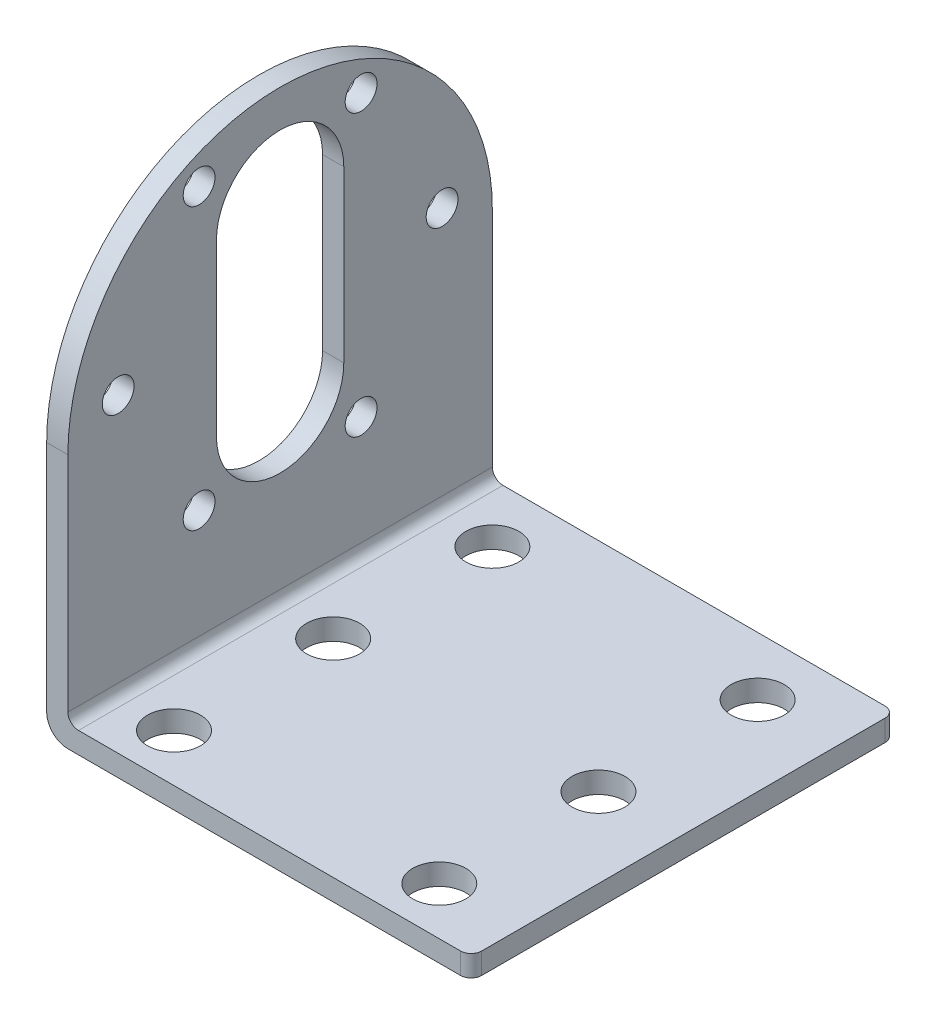
ISO-10303-21;
HEADER;
FILE_DESCRIPTION(('STEP AP214'),'2;1');
FILE_NAME('part.step','',(''),(''),'','','');
FILE_SCHEMA(('AUTOMOTIVE_DESIGN { 1 0 10303 214 1 1 1 1 }'));
ENDSEC;
DATA;
#1=APPLICATION_CONTEXT('core data for automotive mechanical design processes');
#2=APPLICATION_PROTOCOL_DEFINITION('international standard','automotive_design',2000,#1);
#3=PRODUCT_CONTEXT('',#1,'mechanical');
#4=PRODUCT('Part','Part','',(#3));
#5=PRODUCT_RELATED_PRODUCT_CATEGORY('part','',(#4));
#6=PRODUCT_DEFINITION_FORMATION('','',#4);
#7=PRODUCT_DEFINITION_CONTEXT('part definition',#1,'design');
#8=PRODUCT_DEFINITION('design','',#6,#7);
#9=PRODUCT_DEFINITION_SHAPE('','',#8);
#10=(LENGTH_UNIT() NAMED_UNIT(*) SI_UNIT(.MILLI.,.METRE.));
#11=(NAMED_UNIT(*) PLANE_ANGLE_UNIT() SI_UNIT($,.RADIAN.));
#12=(NAMED_UNIT(*) SI_UNIT($,.STERADIAN.) SOLID_ANGLE_UNIT());
#13=UNCERTAINTY_MEASURE_WITH_UNIT(LENGTH_MEASURE(1.E-05),#10,'distance_accuracy_value','');
#14=(GEOMETRIC_REPRESENTATION_CONTEXT(3) GLOBAL_UNCERTAINTY_ASSIGNED_CONTEXT((#13)) GLOBAL_UNIT_ASSIGNED_CONTEXT((#10,
#11,#12)) REPRESENTATION_CONTEXT('',''));
#15=CARTESIAN_POINT('',(0.,0.,0.));
#16=DIRECTION('',(0.,0.,1.));
#17=DIRECTION('',(1.,0.,0.));
#18=AXIS2_PLACEMENT_3D('',#15,#16,#17);
#19=CARTESIAN_POINT('',(2.,3.,40.));
#20=DIRECTION('',(-1.,0.,0.));
#21=DIRECTION('',(0.,0.,1.));
#22=AXIS2_PLACEMENT_3D('',#19,#20,#21);
#23=PLANE('',#22);
#24=CARTESIAN_POINT('',(2.,26.5,4.735));
#25=DIRECTION('',(1.,0.,0.));
#26=DIRECTION('',(0.,0.,-1.));
#27=AXIS2_PLACEMENT_3D('',#24,#25,#26);
#28=CIRCLE('',#27,1.5);
#29=CARTESIAN_POINT('',(2.,26.5,3.235));
#30=VERTEX_POINT('',#29);
#31=EDGE_CURVE('E274',#30,#30,#28,.T.);
#32=ORIENTED_EDGE('',*,*,#31,.F.);
#33=EDGE_LOOP('',(#32));
#34=FACE_BOUND('',#33,.T.);
#35=CARTESIAN_POINT('',(2.,39.7198777887694,12.3674999999999));
#36=DIRECTION('',(1.,0.,0.));
#37=DIRECTION('',(0.,0.,-1.));
#38=AXIS2_PLACEMENT_3D('',#35,#36,#37);
#39=CIRCLE('',#38,1.5);
#40=CARTESIAN_POINT('',(2.,39.7198777887694,10.8674999999999));
#41=VERTEX_POINT('',#40);
#42=EDGE_CURVE('E304',#41,#41,#39,.T.);
#43=ORIENTED_EDGE('',*,*,#42,.F.);
#44=EDGE_LOOP('',(#43));
#45=FACE_BOUND('',#44,.T.);
#46=CARTESIAN_POINT('',(2.,26.5,35.265));
#47=DIRECTION('',(1.,0.,0.));
#48=DIRECTION('',(0.,0.,-1.));
#49=AXIS2_PLACEMENT_3D('',#46,#47,#48);
#50=CIRCLE('',#49,1.5);
#51=CARTESIAN_POINT('',(2.,26.5,33.765));
#52=VERTEX_POINT('',#51);
#53=EDGE_CURVE('E317',#52,#52,#50,.T.);
#54=ORIENTED_EDGE('',*,*,#53,.F.);
#55=EDGE_LOOP('',(#54));
#56=FACE_BOUND('',#55,.T.);
#57=CARTESIAN_POINT('',(2.,13.2801222112306,27.6325000000001));
#58=DIRECTION('',(1.,0.,0.));
#59=DIRECTION('',(0.,0.,-1.));
#60=AXIS2_PLACEMENT_3D('',#57,#58,#59);
#61=CIRCLE('',#60,1.5);
#62=CARTESIAN_POINT('',(2.,13.2801222112306,26.1325000000001));
#63=VERTEX_POINT('',#62);
#64=EDGE_CURVE('E324',#63,#63,#61,.T.);
#65=ORIENTED_EDGE('',*,*,#64,.F.);
#66=EDGE_LOOP('',(#65));
#67=FACE_BOUND('',#66,.T.);
#68=CARTESIAN_POINT('',(2.,13.2801222112306,12.3674999999999));
#69=DIRECTION('',(1.,0.,0.));
#70=DIRECTION('',(0.,0.,-1.));
#71=AXIS2_PLACEMENT_3D('',#68,#69,#70);
#72=CIRCLE('',#71,1.5);
#73=CARTESIAN_POINT('',(2.,13.2801222112306,10.8674999999999));
#74=VERTEX_POINT('',#73);
#75=EDGE_CURVE('E318',#74,#74,#72,.T.);
#76=ORIENTED_EDGE('',*,*,#75,.F.);
#77=EDGE_LOOP('',(#76));
#78=FACE_BOUND('',#77,.T.);
#79=CARTESIAN_POINT('',(2.,39.7198777887694,27.6325000000001));
#80=DIRECTION('',(1.,0.,0.));
#81=DIRECTION('',(0.,0.,-1.));
#82=AXIS2_PLACEMENT_3D('',#79,#80,#81);
#83=CIRCLE('',#82,1.5);
#84=CARTESIAN_POINT('',(2.,39.7198777887694,26.1325000000001));
#85=VERTEX_POINT('',#84);
#86=EDGE_CURVE('E316',#85,#85,#83,.T.);
#87=ORIENTED_EDGE('',*,*,#86,.F.);
#88=EDGE_LOOP('',(#87));
#89=FACE_BOUND('',#88,.T.);
#90=DIRECTION('',(0.,-1.,0.));
#91=VECTOR('',#90,1.);
#92=CARTESIAN_POINT('',(2.,34.5,26.));
#93=LINE('',#92,#91);
#94=CARTESIAN_POINT('',(2.,34.5,26.));
#95=VERTEX_POINT('',#94);
#96=CARTESIAN_POINT('',(2.,18.5,26.));
#97=VERTEX_POINT('',#96);
#98=EDGE_CURVE('E164',#95,#97,#93,.T.);
#99=ORIENTED_EDGE('',*,*,#98,.F.);
#100=CARTESIAN_POINT('',(2.,34.5,20.));
#101=DIRECTION('',(1.,0.,0.));
#102=DIRECTION('',(0.,0.,-1.));
#103=AXIS2_PLACEMENT_3D('',#100,#101,#102);
#104=CIRCLE('',#103,5.99999999999999);
#105=CARTESIAN_POINT('',(2.,34.5,14.));
#106=VERTEX_POINT('',#105);
#107=EDGE_CURVE('E167',#106,#95,#104,.T.);
#108=ORIENTED_EDGE('',*,*,#107,.F.);
#109=DIRECTION('',(0.,1.,0.));
#110=VECTOR('',#109,1.);
#111=CARTESIAN_POINT('',(2.,34.5,14.));
#112=LINE('',#111,#110);
#113=CARTESIAN_POINT('',(2.,18.5,14.));
#114=VERTEX_POINT('',#113);
#115=EDGE_CURVE('E172',#114,#106,#112,.T.);
#116=ORIENTED_EDGE('',*,*,#115,.F.);
#117=CARTESIAN_POINT('',(2.,18.5,20.));
#118=DIRECTION('',(1.,0.,0.));
#119=DIRECTION('',(0.,0.,-1.));
#120=AXIS2_PLACEMENT_3D('',#117,#118,#119);
#121=CIRCLE('',#120,5.99999999999999);
#122=EDGE_CURVE('E153',#97,#114,#121,.T.);
#123=ORIENTED_EDGE('',*,*,#122,.F.);
#124=EDGE_LOOP('',(#99,#108,#116,#123));
#125=FACE_BOUND('',#124,.T.);
#126=DIRECTION('',(0.,1.,0.));
#127=VECTOR('',#126,1.);
#128=CARTESIAN_POINT('',(2.,3.,0.));
#129=LINE('',#128,#127);
#130=CARTESIAN_POINT('',(2.,3.,0.));
#131=VERTEX_POINT('',#130);
#132=CARTESIAN_POINT('',(2.,24.,0.));
#133=VERTEX_POINT('',#132);
#134=EDGE_CURVE('E231',#131,#133,#129,.T.);
#135=ORIENTED_EDGE('',*,*,#134,.T.);
#136=CARTESIAN_POINT('',(2.,24.,20.));
#137=DIRECTION('',(1.,0.,0.));
#138=DIRECTION('',(0.,0.,-1.));
#139=AXIS2_PLACEMENT_3D('',#136,#137,#138);
#140=CIRCLE('',#139,20.);
#141=CARTESIAN_POINT('',(2.,24.,40.));
#142=VERTEX_POINT('',#141);
#143=EDGE_CURVE('E181',#142,#133,#140,.F.);
#144=ORIENTED_EDGE('',*,*,#143,.F.);
#145=DIRECTION('',(0.,1.,0.));
#146=VECTOR('',#145,1.);
#147=CARTESIAN_POINT('',(2.,3.,40.));
#148=LINE('',#147,#146);
#149=CARTESIAN_POINT('',(2.,3.,40.));
#150=VERTEX_POINT('',#149);
#151=EDGE_CURVE('E219',#150,#142,#148,.T.);
#152=ORIENTED_EDGE('',*,*,#151,.F.);
#153=DIRECTION('',(0.,0.,-1.));
#154=VECTOR('',#153,1.);
#155=CARTESIAN_POINT('',(2.,3.,40.));
#156=LINE('',#155,#154);
#157=EDGE_CURVE('E248',#150,#131,#156,.T.);
#158=ORIENTED_EDGE('',*,*,#157,.T.);
#159=EDGE_LOOP('',(#135,#144,#152,#158));
#160=FACE_BOUND('',#159,.T.);
#161=ADVANCED_FACE('F45',(#34,#45,#56,#67,#78,#89,#125,#160),#23,.F.);
#162=CARTESIAN_POINT('',(0.,2.00000000000001,40.));
#163=DIRECTION('',(1.,0.,0.));
#164=DIRECTION('',(0.,0.,-1.));
#165=AXIS2_PLACEMENT_3D('',#162,#163,#164);
#166=PLANE('',#165);
#167=CARTESIAN_POINT('',(0.,26.5,4.735));
#168=DIRECTION('',(1.,0.,0.));
#169=DIRECTION('',(0.,0.,-1.));
#170=AXIS2_PLACEMENT_3D('',#167,#168,#169);
#171=CIRCLE('',#170,1.5);
#172=CARTESIAN_POINT('',(0.,26.5,3.235));
#173=VERTEX_POINT('',#172);
#174=EDGE_CURVE('E286',#173,#173,#171,.T.);
#175=ORIENTED_EDGE('',*,*,#174,.T.);
#176=EDGE_LOOP('',(#175));
#177=FACE_BOUND('',#176,.T.);
#178=CARTESIAN_POINT('',(0.,39.7198777887694,12.3674999999999));
#179=DIRECTION('',(1.,0.,0.));
#180=DIRECTION('',(0.,0.,-1.));
#181=AXIS2_PLACEMENT_3D('',#178,#179,#180);
#182=CIRCLE('',#181,1.5);
#183=CARTESIAN_POINT('',(0.,39.7198777887694,10.8674999999999));
#184=VERTEX_POINT('',#183);
#185=EDGE_CURVE('E282',#184,#184,#182,.T.);
#186=ORIENTED_EDGE('',*,*,#185,.T.);
#187=EDGE_LOOP('',(#186));
#188=FACE_BOUND('',#187,.T.);
#189=CARTESIAN_POINT('',(0.,26.5,35.265));
#190=DIRECTION('',(1.,0.,0.));
#191=DIRECTION('',(0.,0.,-1.));
#192=AXIS2_PLACEMENT_3D('',#189,#190,#191);
#193=CIRCLE('',#192,1.5);
#194=CARTESIAN_POINT('',(0.,26.5,33.765));
#195=VERTEX_POINT('',#194);
#196=EDGE_CURVE('E278',#195,#195,#193,.T.);
#197=ORIENTED_EDGE('',*,*,#196,.T.);
#198=EDGE_LOOP('',(#197));
#199=FACE_BOUND('',#198,.T.);
#200=CARTESIAN_POINT('',(0.,13.2801222112306,27.6325000000001));
#201=DIRECTION('',(1.,0.,0.));
#202=DIRECTION('',(0.,0.,-1.));
#203=AXIS2_PLACEMENT_3D('',#200,#201,#202);
#204=CIRCLE('',#203,1.5);
#205=CARTESIAN_POINT('',(0.,13.2801222112306,26.1325000000001));
#206=VERTEX_POINT('',#205);
#207=EDGE_CURVE('E280',#206,#206,#204,.T.);
#208=ORIENTED_EDGE('',*,*,#207,.T.);
#209=EDGE_LOOP('',(#208));
#210=FACE_BOUND('',#209,.T.);
#211=CARTESIAN_POINT('',(0.,13.2801222112306,12.3674999999999));
#212=DIRECTION('',(1.,0.,0.));
#213=DIRECTION('',(0.,0.,-1.));
#214=AXIS2_PLACEMENT_3D('',#211,#212,#213);
#215=CIRCLE('',#214,1.5);
#216=CARTESIAN_POINT('',(0.,13.2801222112306,10.8674999999999));
#217=VERTEX_POINT('',#216);
#218=EDGE_CURVE('E271',#217,#217,#215,.T.);
#219=ORIENTED_EDGE('',*,*,#218,.T.);
#220=EDGE_LOOP('',(#219));
#221=FACE_BOUND('',#220,.T.);
#222=CARTESIAN_POINT('',(0.,39.7198777887694,27.6325000000001));
#223=DIRECTION('',(1.,0.,0.));
#224=DIRECTION('',(0.,0.,-1.));
#225=AXIS2_PLACEMENT_3D('',#222,#223,#224);
#226=CIRCLE('',#225,1.5);
#227=CARTESIAN_POINT('',(0.,39.7198777887694,26.1325000000001));
#228=VERTEX_POINT('',#227);
#229=EDGE_CURVE('E269',#228,#228,#226,.T.);
#230=ORIENTED_EDGE('',*,*,#229,.T.);
#231=EDGE_LOOP('',(#230));
#232=FACE_BOUND('',#231,.T.);
#233=DIRECTION('',(0.,1.,0.));
#234=VECTOR('',#233,1.);
#235=CARTESIAN_POINT('',(0.,2.00000000000002,14.));
#236=LINE('',#235,#234);
#237=CARTESIAN_POINT('',(0.,18.5,14.));
#238=VERTEX_POINT('',#237);
#239=CARTESIAN_POINT('',(0.,34.5,14.));
#240=VERTEX_POINT('',#239);
#241=EDGE_CURVE('E262',#238,#240,#236,.T.);
#242=ORIENTED_EDGE('',*,*,#241,.T.);
#243=CARTESIAN_POINT('',(0.,34.5,20.));
#244=DIRECTION('',(1.,0.,0.));
#245=DIRECTION('',(0.,0.,-1.));
#246=AXIS2_PLACEMENT_3D('',#243,#244,#245);
#247=CIRCLE('',#246,5.99999999999999);
#248=CARTESIAN_POINT('',(0.,34.5,26.));
#249=VERTEX_POINT('',#248);
#250=EDGE_CURVE('E266',#240,#249,#247,.T.);
#251=ORIENTED_EDGE('',*,*,#250,.T.);
#252=DIRECTION('',(0.,-1.,0.));
#253=VECTOR('',#252,1.);
#254=CARTESIAN_POINT('',(0.,2.00000000000002,26.));
#255=LINE('',#254,#253);
#256=CARTESIAN_POINT('',(0.,18.5,26.));
#257=VERTEX_POINT('',#256);
#258=EDGE_CURVE('E258',#249,#257,#255,.T.);
#259=ORIENTED_EDGE('',*,*,#258,.T.);
#260=CARTESIAN_POINT('',(0.,18.5,20.));
#261=DIRECTION('',(1.,0.,0.));
#262=DIRECTION('',(0.,0.,-1.));
#263=AXIS2_PLACEMENT_3D('',#260,#261,#262);
#264=CIRCLE('',#263,5.99999999999999);
#265=EDGE_CURVE('E160',#257,#238,#264,.T.);
#266=ORIENTED_EDGE('',*,*,#265,.T.);
#267=EDGE_LOOP('',(#242,#251,#259,#266));
#268=FACE_BOUND('',#267,.T.);
#269=DIRECTION('',(0.,-1.,0.));
#270=VECTOR('',#269,1.);
#271=CARTESIAN_POINT('',(0.,2.00000000000001,40.));
#272=LINE('',#271,#270);
#273=CARTESIAN_POINT('',(0.,24.,40.));
#274=VERTEX_POINT('',#273);
#275=CARTESIAN_POINT('',(0.,2.,40.));
#276=VERTEX_POINT('',#275);
#277=EDGE_CURVE('E222',#274,#276,#272,.T.);
#278=ORIENTED_EDGE('',*,*,#277,.F.);
#279=CARTESIAN_POINT('',(0.,24.,20.));
#280=DIRECTION('',(1.,0.,0.));
#281=DIRECTION('',(0.,0.,-1.));
#282=AXIS2_PLACEMENT_3D('',#279,#280,#281);
#283=CIRCLE('',#282,20.);
#284=CARTESIAN_POINT('',(0.,24.,0.));
#285=VERTEX_POINT('',#284);
#286=EDGE_CURVE('E190',#274,#285,#283,.F.);
#287=ORIENTED_EDGE('',*,*,#286,.T.);
#288=DIRECTION('',(0.,-1.,0.));
#289=VECTOR('',#288,1.);
#290=CARTESIAN_POINT('',(0.,2.00000000000001,0.));
#291=LINE('',#290,#289);
#292=CARTESIAN_POINT('',(0.,2.,0.));
#293=VERTEX_POINT('',#292);
#294=EDGE_CURVE('E236',#285,#293,#291,.T.);
#295=ORIENTED_EDGE('',*,*,#294,.T.);
#296=DIRECTION('',(0.,0.,-1.));
#297=VECTOR('',#296,1.);
#298=CARTESIAN_POINT('',(0.,2.,40.));
#299=LINE('',#298,#297);
#300=EDGE_CURVE('E246',#276,#293,#299,.T.);
#301=ORIENTED_EDGE('',*,*,#300,.F.);
#302=EDGE_LOOP('',(#278,#287,#295,#301));
#303=FACE_BOUND('',#302,.T.);
#304=ADVANCED_FACE('F334',(#177,#188,#199,#210,#221,#232,#268,#303),#166,.F.);
#305=CARTESIAN_POINT('',(3.,2.,40.));
#306=DIRECTION('',(0.,-1.,0.));
#307=DIRECTION('',(0.,0.,-1.));
#308=AXIS2_PLACEMENT_3D('',#305,#306,#307);
#309=PLANE('',#308);
#310=CARTESIAN_POINT('',(7.5,2.,20.5));
#311=DIRECTION('',(0.,1.,0.));
#312=DIRECTION('',(0.,0.,1.));
#313=AXIS2_PLACEMENT_3D('',#310,#311,#312);
#314=CIRCLE('',#313,2.5);
#315=CARTESIAN_POINT('',(7.5,2.,23.));
#316=VERTEX_POINT('',#315);
#317=EDGE_CURVE('E301',#316,#316,#314,.T.);
#318=ORIENTED_EDGE('',*,*,#317,.F.);
#319=EDGE_LOOP('',(#318));
#320=FACE_BOUND('',#319,.T.);
#321=CARTESIAN_POINT('',(32.5,2.,20.5));
#322=DIRECTION('',(0.,1.,0.));
#323=DIRECTION('',(0.,0.,1.));
#324=AXIS2_PLACEMENT_3D('',#321,#322,#323);
#325=CIRCLE('',#324,2.5);
#326=CARTESIAN_POINT('',(32.5,2.,23.));
#327=VERTEX_POINT('',#326);
#328=EDGE_CURVE('E310',#327,#327,#325,.T.);
#329=ORIENTED_EDGE('',*,*,#328,.F.);
#330=EDGE_LOOP('',(#329));
#331=FACE_BOUND('',#330,.T.);
#332=CARTESIAN_POINT('',(32.5,2.,35.5));
#333=DIRECTION('',(0.,1.,0.));
#334=DIRECTION('',(0.,0.,1.));
#335=AXIS2_PLACEMENT_3D('',#332,#333,#334);
#336=CIRCLE('',#335,2.50000000000002);
#337=CARTESIAN_POINT('',(32.5,2.,38.));
#338=VERTEX_POINT('',#337);
#339=EDGE_CURVE('E188',#338,#338,#336,.T.);
#340=ORIENTED_EDGE('',*,*,#339,.F.);
#341=EDGE_LOOP('',(#340));
#342=FACE_BOUND('',#341,.T.);
#343=CARTESIAN_POINT('',(32.5,2.,5.5));
#344=DIRECTION('',(0.,1.,0.));
#345=DIRECTION('',(0.,0.,1.));
#346=AXIS2_PLACEMENT_3D('',#343,#344,#345);
#347=CIRCLE('',#346,2.50000000000002);
#348=CARTESIAN_POINT('',(32.5,2.,8.00000000000002));
#349=VERTEX_POINT('',#348);
#350=EDGE_CURVE('E196',#349,#349,#347,.T.);
#351=ORIENTED_EDGE('',*,*,#350,.F.);
#352=EDGE_LOOP('',(#351));
#353=FACE_BOUND('',#352,.T.);
#354=CARTESIAN_POINT('',(7.5,2.,5.5));
#355=DIRECTION('',(0.,1.,0.));
#356=DIRECTION('',(0.,0.,1.));
#357=AXIS2_PLACEMENT_3D('',#354,#355,#356);
#358=CIRCLE('',#357,2.50000000000001);
#359=CARTESIAN_POINT('',(7.5,2.,8.00000000000002));
#360=VERTEX_POINT('',#359);
#361=EDGE_CURVE('E205',#360,#360,#358,.T.);
#362=ORIENTED_EDGE('',*,*,#361,.F.);
#363=EDGE_LOOP('',(#362));
#364=FACE_BOUND('',#363,.T.);
#365=DIRECTION('',(0.,0.,-1.));
#366=VECTOR('',#365,1.);
#367=CARTESIAN_POINT('',(40.,2.,40.));
#368=LINE('',#367,#366);
#369=CARTESIAN_POINT('',(40.,2.,39.));
#370=VERTEX_POINT('',#369);
#371=CARTESIAN_POINT('',(40.,2.,1.));
#372=VERTEX_POINT('',#371);
#373=EDGE_CURVE('E253',#370,#372,#368,.T.);
#374=ORIENTED_EDGE('',*,*,#373,.T.);
#375=CARTESIAN_POINT('',(39.,2.,1.));
#376=DIRECTION('',(0.,-1.,0.));
#377=DIRECTION('',(0.,0.,-1.));
#378=AXIS2_PLACEMENT_3D('',#375,#376,#377);
#379=CIRCLE('',#378,1.);
#380=CARTESIAN_POINT('',(39.,2.,0.));
#381=VERTEX_POINT('',#380);
#382=EDGE_CURVE('E294',#372,#381,#379,.F.);
#383=ORIENTED_EDGE('',*,*,#382,.T.);
#384=DIRECTION('',(-1.,0.,0.));
#385=VECTOR('',#384,1.);
#386=CARTESIAN_POINT('',(3.,2.,0.));
#387=LINE('',#386,#385);
#388=CARTESIAN_POINT('',(3.,2.,0.));
#389=VERTEX_POINT('',#388);
#390=EDGE_CURVE('E211',#381,#389,#387,.T.);
#391=ORIENTED_EDGE('',*,*,#390,.T.);
#392=DIRECTION('',(0.,0.,-1.));
#393=VECTOR('',#392,1.);
#394=CARTESIAN_POINT('',(3.,2.,40.));
#395=LINE('',#394,#393);
#396=CARTESIAN_POINT('',(3.,2.,40.));
#397=VERTEX_POINT('',#396);
#398=EDGE_CURVE('E255',#397,#389,#395,.T.);
#399=ORIENTED_EDGE('',*,*,#398,.F.);
#400=DIRECTION('',(-1.,0.,0.));
#401=VECTOR('',#400,1.);
#402=CARTESIAN_POINT('',(3.,2.,40.));
#403=LINE('',#402,#401);
#404=CARTESIAN_POINT('',(39.,2.,40.));
#405=VERTEX_POINT('',#404);
#406=EDGE_CURVE('E213',#405,#397,#403,.T.);
#407=ORIENTED_EDGE('',*,*,#406,.F.);
#408=CARTESIAN_POINT('',(39.,2.,39.));
#409=DIRECTION('',(0.,-1.,0.));
#410=DIRECTION('',(0.,0.,-1.));
#411=AXIS2_PLACEMENT_3D('',#408,#409,#410);
#412=CIRCLE('',#411,1.);
#413=EDGE_CURVE('E291',#405,#370,#412,.F.);
#414=ORIENTED_EDGE('',*,*,#413,.T.);
#415=EDGE_LOOP('',(#374,#383,#391,#399,#407,#414));
#416=FACE_BOUND('',#415,.T.);
#417=CARTESIAN_POINT('',(7.5,2.,35.5));
#418=DIRECTION('',(0.,1.,0.));
#419=DIRECTION('',(0.,0.,1.));
#420=AXIS2_PLACEMENT_3D('',#417,#418,#419);
#421=CIRCLE('',#420,2.50000000000001);
#422=CARTESIAN_POINT('',(7.5,2.,38.));
#423=VERTEX_POINT('',#422);
#424=EDGE_CURVE('E206',#423,#423,#421,.T.);
#425=ORIENTED_EDGE('',*,*,#424,.F.);
#426=EDGE_LOOP('',(#425));
#427=FACE_BOUND('',#426,.T.);
#428=ADVANCED_FACE('F336',(#320,#331,#342,#353,#364,#416,#427),#309,.F.);
#429=CARTESIAN_POINT('',(40.,2.,40.));
#430=DIRECTION('',(-1.,0.,0.));
#431=DIRECTION('',(0.,0.,1.));
#432=AXIS2_PLACEMENT_3D('',#429,#430,#431);
#433=PLANE('',#432);
#434=DIRECTION('',(0.,0.,-1.));
#435=VECTOR('',#434,1.);
#436=CARTESIAN_POINT('',(40.,0.,40.));
#437=LINE('',#436,#435);
#438=CARTESIAN_POINT('',(40.,0.,39.));
#439=VERTEX_POINT('',#438);
#440=CARTESIAN_POINT('',(40.,0.,1.));
#441=VERTEX_POINT('',#440);
#442=EDGE_CURVE('E230',#439,#441,#437,.T.);
#443=ORIENTED_EDGE('',*,*,#442,.T.);
#444=DIRECTION('',(0.,1.,0.));
#445=VECTOR('',#444,1.);
#446=CARTESIAN_POINT('',(40.,2.,1.));
#447=LINE('',#446,#445);
#448=EDGE_CURVE('E289',#441,#372,#447,.T.);
#449=ORIENTED_EDGE('',*,*,#448,.T.);
#450=ORIENTED_EDGE('',*,*,#373,.F.);
#451=DIRECTION('',(0.,1.,0.));
#452=VECTOR('',#451,1.);
#453=CARTESIAN_POINT('',(40.,2.,39.));
#454=LINE('',#453,#452);
#455=EDGE_CURVE('E268',#370,#439,#454,.F.);
#456=ORIENTED_EDGE('',*,*,#455,.T.);
#457=EDGE_LOOP('',(#443,#449,#450,#456));
#458=FACE_BOUND('',#457,.T.);
#459=ADVANCED_FACE('F371',(#458),#433,.F.);
#460=CARTESIAN_POINT('',(3.,3.,40.));
#461=DIRECTION('',(0.,0.,-1.));
#462=DIRECTION('',(-1.,0.,0.));
#463=AXIS2_PLACEMENT_3D('',#460,#461,#462);
#464=CYLINDRICAL_SURFACE('',#463,1.);
#465=CARTESIAN_POINT('',(3.,3.,0.));
#466=DIRECTION('',(0.,0.,-1.));
#467=DIRECTION('',(-1.,0.,0.));
#468=AXIS2_PLACEMENT_3D('',#465,#466,#467);
#469=CIRCLE('',#468,1.);
#470=EDGE_CURVE('E233',#389,#131,#469,.T.);
#471=ORIENTED_EDGE('',*,*,#470,.T.);
#472=ORIENTED_EDGE('',*,*,#157,.F.);
#473=CARTESIAN_POINT('',(3.,3.,40.));
#474=DIRECTION('',(0.,0.,-1.));
#475=DIRECTION('',(-1.,0.,0.));
#476=AXIS2_PLACEMENT_3D('',#473,#474,#475);
#477=CIRCLE('',#476,1.);
#478=EDGE_CURVE('E220',#397,#150,#477,.T.);
#479=ORIENTED_EDGE('',*,*,#478,.F.);
#480=ORIENTED_EDGE('',*,*,#398,.T.);
#481=EDGE_LOOP('',(#471,#472,#479,#480));
#482=FACE_BOUND('',#481,.T.);
#483=ADVANCED_FACE('F377',(#482),#464,.F.);
#484=CARTESIAN_POINT('',(2.,2.,40.));
#485=DIRECTION('',(0.,0.,-1.));
#486=DIRECTION('',(-1.,0.,0.));
#487=AXIS2_PLACEMENT_3D('',#484,#485,#486);
#488=CYLINDRICAL_SURFACE('',#487,2.);
#489=CARTESIAN_POINT('',(2.,2.,0.));
#490=DIRECTION('',(0.,0.,1.));
#491=DIRECTION('',(-1.,0.,0.));
#492=AXIS2_PLACEMENT_3D('',#489,#490,#491);
#493=CIRCLE('',#492,2.);
#494=CARTESIAN_POINT('',(2.00000000000001,0.,0.));
#495=VERTEX_POINT('',#494);
#496=EDGE_CURVE('E238',#293,#495,#493,.T.);
#497=ORIENTED_EDGE('',*,*,#496,.T.);
#498=DIRECTION('',(0.,0.,-1.));
#499=VECTOR('',#498,1.);
#500=CARTESIAN_POINT('',(2.00000000000001,0.,40.));
#501=LINE('',#500,#499);
#502=CARTESIAN_POINT('',(2.00000000000001,0.,40.));
#503=VERTEX_POINT('',#502);
#504=EDGE_CURVE('E243',#503,#495,#501,.T.);
#505=ORIENTED_EDGE('',*,*,#504,.F.);
#506=CARTESIAN_POINT('',(2.,2.,40.));
#507=DIRECTION('',(0.,0.,1.));
#508=DIRECTION('',(-1.,0.,0.));
#509=AXIS2_PLACEMENT_3D('',#506,#507,#508);
#510=CIRCLE('',#509,2.);
#511=EDGE_CURVE('E224',#276,#503,#510,.T.);
#512=ORIENTED_EDGE('',*,*,#511,.F.);
#513=ORIENTED_EDGE('',*,*,#300,.T.);
#514=EDGE_LOOP('',(#497,#505,#512,#513));
#515=FACE_BOUND('',#514,.T.);
#516=ADVANCED_FACE('F359',(#515),#488,.T.);
#517=CARTESIAN_POINT('',(2.00000000000001,0.,40.));
#518=DIRECTION('',(0.,1.,0.));
#519=DIRECTION('',(0.,0.,1.));
#520=AXIS2_PLACEMENT_3D('',#517,#518,#519);
#521=PLANE('',#520);
#522=CARTESIAN_POINT('',(7.5,0.,20.5));
#523=DIRECTION('',(0.,1.,0.));
#524=DIRECTION('',(0.,0.,1.));
#525=AXIS2_PLACEMENT_3D('',#522,#523,#524);
#526=CIRCLE('',#525,2.5);
#527=CARTESIAN_POINT('',(7.5,0.,23.));
#528=VERTEX_POINT('',#527);
#529=EDGE_CURVE('E46',#528,#528,#526,.T.);
#530=ORIENTED_EDGE('',*,*,#529,.T.);
#531=EDGE_LOOP('',(#530));
#532=FACE_BOUND('',#531,.T.);
#533=CARTESIAN_POINT('',(32.5,0.,20.5));
#534=DIRECTION('',(0.,1.,0.));
#535=DIRECTION('',(0.,0.,1.));
#536=AXIS2_PLACEMENT_3D('',#533,#534,#535);
#537=CIRCLE('',#536,2.5);
#538=CARTESIAN_POINT('',(32.5,0.,23.));
#539=VERTEX_POINT('',#538);
#540=EDGE_CURVE('E299',#539,#539,#537,.T.);
#541=ORIENTED_EDGE('',*,*,#540,.T.);
#542=EDGE_LOOP('',(#541));
#543=FACE_BOUND('',#542,.T.);
#544=CARTESIAN_POINT('',(32.5,0.,35.5));
#545=DIRECTION('',(0.,1.,0.));
#546=DIRECTION('',(0.,0.,1.));
#547=AXIS2_PLACEMENT_3D('',#544,#545,#546);
#548=CIRCLE('',#547,2.50000000000002);
#549=CARTESIAN_POINT('',(32.5,0.,38.));
#550=VERTEX_POINT('',#549);
#551=EDGE_CURVE('E194',#550,#550,#548,.T.);
#552=ORIENTED_EDGE('',*,*,#551,.T.);
#553=EDGE_LOOP('',(#552));
#554=FACE_BOUND('',#553,.T.);
#555=CARTESIAN_POINT('',(32.5,0.,5.5));
#556=DIRECTION('',(0.,1.,0.));
#557=DIRECTION('',(0.,0.,1.));
#558=AXIS2_PLACEMENT_3D('',#555,#556,#557);
#559=CIRCLE('',#558,2.50000000000002);
#560=CARTESIAN_POINT('',(32.5,0.,8.00000000000002));
#561=VERTEX_POINT('',#560);
#562=EDGE_CURVE('E198',#561,#561,#559,.T.);
#563=ORIENTED_EDGE('',*,*,#562,.T.);
#564=EDGE_LOOP('',(#563));
#565=FACE_BOUND('',#564,.T.);
#566=CARTESIAN_POINT('',(7.5,0.,5.5));
#567=DIRECTION('',(0.,1.,0.));
#568=DIRECTION('',(0.,0.,1.));
#569=AXIS2_PLACEMENT_3D('',#566,#567,#568);
#570=CIRCLE('',#569,2.50000000000001);
#571=CARTESIAN_POINT('',(7.5,0.,8.00000000000002));
#572=VERTEX_POINT('',#571);
#573=EDGE_CURVE('E204',#572,#572,#570,.T.);
#574=ORIENTED_EDGE('',*,*,#573,.T.);
#575=EDGE_LOOP('',(#574));
#576=FACE_BOUND('',#575,.T.);
#577=CARTESIAN_POINT('',(7.5,0.,35.5));
#578=DIRECTION('',(0.,1.,0.));
#579=DIRECTION('',(0.,0.,1.));
#580=AXIS2_PLACEMENT_3D('',#577,#578,#579);
#581=CIRCLE('',#580,2.50000000000001);
#582=CARTESIAN_POINT('',(7.5,0.,38.));
#583=VERTEX_POINT('',#582);
#584=EDGE_CURVE('E212',#583,#583,#581,.T.);
#585=ORIENTED_EDGE('',*,*,#584,.T.);
#586=EDGE_LOOP('',(#585));
#587=FACE_BOUND('',#586,.T.);
#588=DIRECTION('',(1.,0.,0.));
#589=VECTOR('',#588,1.);
#590=CARTESIAN_POINT('',(2.00000000000001,0.,0.));
#591=LINE('',#590,#589);
#592=CARTESIAN_POINT('',(39.,0.,0.));
#593=VERTEX_POINT('',#592);
#594=EDGE_CURVE('E217',#495,#593,#591,.T.);
#595=ORIENTED_EDGE('',*,*,#594,.T.);
#596=CARTESIAN_POINT('',(39.,0.,1.));
#597=DIRECTION('',(0.,1.,0.));
#598=DIRECTION('',(0.,0.,1.));
#599=AXIS2_PLACEMENT_3D('',#596,#597,#598);
#600=CIRCLE('',#599,1.);
#601=EDGE_CURVE('E51',#593,#441,#600,.F.);
#602=ORIENTED_EDGE('',*,*,#601,.T.);
#603=ORIENTED_EDGE('',*,*,#442,.F.);
#604=CARTESIAN_POINT('',(39.,0.,39.));
#605=DIRECTION('',(0.,1.,0.));
#606=DIRECTION('',(0.,0.,1.));
#607=AXIS2_PLACEMENT_3D('',#604,#605,#606);
#608=CIRCLE('',#607,1.);
#609=CARTESIAN_POINT('',(39.,0.,40.));
#610=VERTEX_POINT('',#609);
#611=EDGE_CURVE('E56',#439,#610,#608,.F.);
#612=ORIENTED_EDGE('',*,*,#611,.T.);
#613=DIRECTION('',(1.,0.,0.));
#614=VECTOR('',#613,1.);
#615=CARTESIAN_POINT('',(2.00000000000001,0.,40.));
#616=LINE('',#615,#614);
#617=EDGE_CURVE('E227',#503,#610,#616,.T.);
#618=ORIENTED_EDGE('',*,*,#617,.F.);
#619=ORIENTED_EDGE('',*,*,#504,.T.);
#620=EDGE_LOOP('',(#595,#602,#603,#612,#618,#619));
#621=FACE_BOUND('',#620,.T.);
#622=ADVANCED_FACE('F363',(#532,#543,#554,#565,#576,#587,#621),#521,.F.);
#623=CARTESIAN_POINT('',(2.,2.,40.));
#624=DIRECTION('',(0.,0.,-1.));
#625=DIRECTION('',(-1.,0.,0.));
#626=AXIS2_PLACEMENT_3D('',#623,#624,#625);
#627=PLANE('',#626);
#628=ORIENTED_EDGE('',*,*,#617,.T.);
#629=DIRECTION('',(0.,1.,0.));
#630=VECTOR('',#629,1.);
#631=CARTESIAN_POINT('',(39.,2.,40.));
#632=LINE('',#631,#630);
#633=EDGE_CURVE('E12',#610,#405,#632,.T.);
#634=ORIENTED_EDGE('',*,*,#633,.T.);
#635=ORIENTED_EDGE('',*,*,#406,.T.);
#636=ORIENTED_EDGE('',*,*,#478,.T.);
#637=ORIENTED_EDGE('',*,*,#151,.T.);
#638=DIRECTION('',(1.,0.,0.));
#639=VECTOR('',#638,1.);
#640=CARTESIAN_POINT('',(-38.,24.,40.));
#641=LINE('',#640,#639);
#642=EDGE_CURVE('E184',#274,#142,#641,.T.);
#643=ORIENTED_EDGE('',*,*,#642,.F.);
#644=ORIENTED_EDGE('',*,*,#277,.T.);
#645=ORIENTED_EDGE('',*,*,#511,.T.);
#646=EDGE_LOOP('',(#628,#634,#635,#636,#637,#643,#644,#645));
#647=FACE_BOUND('',#646,.T.);
#648=ADVANCED_FACE('F350',(#647),#627,.F.);
#649=CARTESIAN_POINT('',(2.,2.,0.));
#650=DIRECTION('',(0.,0.,-1.));
#651=DIRECTION('',(-1.,0.,0.));
#652=AXIS2_PLACEMENT_3D('',#649,#650,#651);
#653=PLANE('',#652);
#654=ORIENTED_EDGE('',*,*,#390,.F.);
#655=DIRECTION('',(0.,1.,0.));
#656=VECTOR('',#655,1.);
#657=CARTESIAN_POINT('',(39.,0.,0.));
#658=LINE('',#657,#656);
#659=EDGE_CURVE('E70',#381,#593,#658,.F.);
#660=ORIENTED_EDGE('',*,*,#659,.T.);
#661=ORIENTED_EDGE('',*,*,#594,.F.);
#662=ORIENTED_EDGE('',*,*,#496,.F.);
#663=ORIENTED_EDGE('',*,*,#294,.F.);
#664=DIRECTION('',(1.,0.,0.));
#665=VECTOR('',#664,1.);
#666=CARTESIAN_POINT('',(-38.,24.,0.));
#667=LINE('',#666,#665);
#668=EDGE_CURVE('E259',#133,#285,#667,.F.);
#669=ORIENTED_EDGE('',*,*,#668,.F.);
#670=ORIENTED_EDGE('',*,*,#134,.F.);
#671=ORIENTED_EDGE('',*,*,#470,.F.);
#672=EDGE_LOOP('',(#654,#660,#661,#662,#663,#669,#670,#671));
#673=FACE_BOUND('',#672,.T.);
#674=ADVANCED_FACE('F357',(#673),#653,.T.);
#675=CARTESIAN_POINT('',(7.5,2.,35.5));
#676=DIRECTION('',(0.,1.,0.));
#677=DIRECTION('',(0.,0.,1.));
#678=AXIS2_PLACEMENT_3D('',#675,#676,#677);
#679=CYLINDRICAL_SURFACE('',#678,2.50000000000001);
#680=ORIENTED_EDGE('',*,*,#584,.F.);
#681=EDGE_LOOP('',(#680));
#682=FACE_BOUND('',#681,.T.);
#683=ORIENTED_EDGE('',*,*,#424,.T.);
#684=EDGE_LOOP('',(#683));
#685=FACE_BOUND('',#684,.T.);
#686=ADVANCED_FACE('F405',(#682,#685),#679,.F.);
#687=CARTESIAN_POINT('',(7.5,2.,5.5));
#688=DIRECTION('',(0.,1.,0.));
#689=DIRECTION('',(0.,0.,1.));
#690=AXIS2_PLACEMENT_3D('',#687,#688,#689);
#691=CYLINDRICAL_SURFACE('',#690,2.50000000000001);
#692=ORIENTED_EDGE('',*,*,#573,.F.);
#693=EDGE_LOOP('',(#692));
#694=FACE_BOUND('',#693,.T.);
#695=ORIENTED_EDGE('',*,*,#361,.T.);
#696=EDGE_LOOP('',(#695));
#697=FACE_BOUND('',#696,.T.);
#698=ADVANCED_FACE('F410',(#694,#697),#691,.F.);
#699=CARTESIAN_POINT('',(32.5,2.,5.5));
#700=DIRECTION('',(0.,1.,0.));
#701=DIRECTION('',(0.,0.,1.));
#702=AXIS2_PLACEMENT_3D('',#699,#700,#701);
#703=CYLINDRICAL_SURFACE('',#702,2.50000000000002);
#704=ORIENTED_EDGE('',*,*,#562,.F.);
#705=EDGE_LOOP('',(#704));
#706=FACE_BOUND('',#705,.T.);
#707=ORIENTED_EDGE('',*,*,#350,.T.);
#708=EDGE_LOOP('',(#707));
#709=FACE_BOUND('',#708,.T.);
#710=ADVANCED_FACE('F411',(#706,#709),#703,.F.);
#711=CARTESIAN_POINT('',(32.5,2.,35.5));
#712=DIRECTION('',(0.,1.,0.));
#713=DIRECTION('',(0.,0.,1.));
#714=AXIS2_PLACEMENT_3D('',#711,#712,#713);
#715=CYLINDRICAL_SURFACE('',#714,2.50000000000002);
#716=ORIENTED_EDGE('',*,*,#551,.F.);
#717=EDGE_LOOP('',(#716));
#718=FACE_BOUND('',#717,.T.);
#719=ORIENTED_EDGE('',*,*,#339,.T.);
#720=EDGE_LOOP('',(#719));
#721=FACE_BOUND('',#720,.T.);
#722=ADVANCED_FACE('F414',(#718,#721),#715,.F.);
#723=CARTESIAN_POINT('',(-38.,24.,20.));
#724=DIRECTION('',(1.,0.,0.));
#725=DIRECTION('',(0.,0.,-1.));
#726=AXIS2_PLACEMENT_3D('',#723,#724,#725);
#727=CYLINDRICAL_SURFACE('',#726,20.);
#728=ORIENTED_EDGE('',*,*,#642,.T.);
#729=ORIENTED_EDGE('',*,*,#143,.T.);
#730=ORIENTED_EDGE('',*,*,#668,.T.);
#731=ORIENTED_EDGE('',*,*,#286,.F.);
#732=EDGE_LOOP('',(#728,#729,#730,#731));
#733=FACE_BOUND('',#732,.T.);
#734=ADVANCED_FACE('F355',(#733),#727,.T.);
#735=CARTESIAN_POINT('',(-38.,34.5,20.));
#736=DIRECTION('',(1.,0.,0.));
#737=DIRECTION('',(0.,0.,-1.));
#738=AXIS2_PLACEMENT_3D('',#735,#736,#737);
#739=CYLINDRICAL_SURFACE('',#738,5.99999999999999);
#740=DIRECTION('',(1.,0.,0.));
#741=VECTOR('',#740,1.);
#742=CARTESIAN_POINT('',(-38.,34.5,14.));
#743=LINE('',#742,#741);
#744=EDGE_CURVE('E177',#240,#106,#743,.T.);
#745=ORIENTED_EDGE('',*,*,#744,.T.);
#746=ORIENTED_EDGE('',*,*,#107,.T.);
#747=DIRECTION('',(1.,0.,0.));
#748=VECTOR('',#747,1.);
#749=CARTESIAN_POINT('',(-38.,34.5,26.));
#750=LINE('',#749,#748);
#751=EDGE_CURVE('E163',#249,#95,#750,.T.);
#752=ORIENTED_EDGE('',*,*,#751,.F.);
#753=ORIENTED_EDGE('',*,*,#250,.F.);
#754=EDGE_LOOP('',(#745,#746,#752,#753));
#755=FACE_BOUND('',#754,.T.);
#756=ADVANCED_FACE('F329',(#755),#739,.F.);
#757=CARTESIAN_POINT('',(-38.,34.5,14.));
#758=DIRECTION('',(0.,0.,-1.));
#759=DIRECTION('',(0.,1.,0.));
#760=AXIS2_PLACEMENT_3D('',#757,#758,#759);
#761=PLANE('',#760);
#762=DIRECTION('',(1.,0.,0.));
#763=VECTOR('',#762,1.);
#764=CARTESIAN_POINT('',(-38.,18.5,14.));
#765=LINE('',#764,#763);
#766=EDGE_CURVE('E159',#238,#114,#765,.T.);
#767=ORIENTED_EDGE('',*,*,#766,.T.);
#768=ORIENTED_EDGE('',*,*,#115,.T.);
#769=ORIENTED_EDGE('',*,*,#744,.F.);
#770=ORIENTED_EDGE('',*,*,#241,.F.);
#771=EDGE_LOOP('',(#767,#768,#769,#770));
#772=FACE_BOUND('',#771,.T.);
#773=ADVANCED_FACE('F332',(#772),#761,.F.);
#774=CARTESIAN_POINT('',(-38.,18.5,20.));
#775=DIRECTION('',(1.,0.,0.));
#776=DIRECTION('',(0.,0.,-1.));
#777=AXIS2_PLACEMENT_3D('',#774,#775,#776);
#778=CYLINDRICAL_SURFACE('',#777,5.99999999999999);
#779=DIRECTION('',(1.,0.,0.));
#780=VECTOR('',#779,1.);
#781=CARTESIAN_POINT('',(-38.,18.5,26.));
#782=LINE('',#781,#780);
#783=EDGE_CURVE('E146',#257,#97,#782,.T.);
#784=ORIENTED_EDGE('',*,*,#783,.T.);
#785=ORIENTED_EDGE('',*,*,#122,.T.);
#786=ORIENTED_EDGE('',*,*,#766,.F.);
#787=ORIENTED_EDGE('',*,*,#265,.F.);
#788=EDGE_LOOP('',(#784,#785,#786,#787));
#789=FACE_BOUND('',#788,.T.);
#790=ADVANCED_FACE('F151',(#789),#778,.F.);
#791=CARTESIAN_POINT('',(-38.,34.5,26.));
#792=DIRECTION('',(0.,0.,1.));
#793=DIRECTION('',(0.,-1.,0.));
#794=AXIS2_PLACEMENT_3D('',#791,#792,#793);
#795=PLANE('',#794);
#796=ORIENTED_EDGE('',*,*,#751,.T.);
#797=ORIENTED_EDGE('',*,*,#98,.T.);
#798=ORIENTED_EDGE('',*,*,#783,.F.);
#799=ORIENTED_EDGE('',*,*,#258,.F.);
#800=EDGE_LOOP('',(#796,#797,#798,#799));
#801=FACE_BOUND('',#800,.T.);
#802=ADVANCED_FACE('F168',(#801),#795,.F.);
#803=CARTESIAN_POINT('',(-38.,39.7198777887694,27.6325000000001));
#804=DIRECTION('',(1.,0.,0.));
#805=DIRECTION('',(0.,0.,-1.));
#806=AXIS2_PLACEMENT_3D('',#803,#804,#805);
#807=CYLINDRICAL_SURFACE('',#806,1.5);
#808=ORIENTED_EDGE('',*,*,#86,.T.);
#809=EDGE_LOOP('',(#808));
#810=FACE_BOUND('',#809,.T.);
#811=ORIENTED_EDGE('',*,*,#229,.F.);
#812=EDGE_LOOP('',(#811));
#813=FACE_BOUND('',#812,.T.);
#814=ADVANCED_FACE('F424',(#810,#813),#807,.F.);
#815=CARTESIAN_POINT('',(-38.,13.2801222112306,12.3674999999999));
#816=DIRECTION('',(1.,0.,0.));
#817=DIRECTION('',(0.,0.,-1.));
#818=AXIS2_PLACEMENT_3D('',#815,#816,#817);
#819=CYLINDRICAL_SURFACE('',#818,1.5);
#820=ORIENTED_EDGE('',*,*,#75,.T.);
#821=EDGE_LOOP('',(#820));
#822=FACE_BOUND('',#821,.T.);
#823=ORIENTED_EDGE('',*,*,#218,.F.);
#824=EDGE_LOOP('',(#823));
#825=FACE_BOUND('',#824,.T.);
#826=ADVANCED_FACE('F432',(#822,#825),#819,.F.);
#827=CARTESIAN_POINT('',(-38.,13.2801222112306,27.6325000000001));
#828=DIRECTION('',(1.,0.,0.));
#829=DIRECTION('',(0.,0.,-1.));
#830=AXIS2_PLACEMENT_3D('',#827,#828,#829);
#831=CYLINDRICAL_SURFACE('',#830,1.5);
#832=ORIENTED_EDGE('',*,*,#64,.T.);
#833=EDGE_LOOP('',(#832));
#834=FACE_BOUND('',#833,.T.);
#835=ORIENTED_EDGE('',*,*,#207,.F.);
#836=EDGE_LOOP('',(#835));
#837=FACE_BOUND('',#836,.T.);
#838=ADVANCED_FACE('F427',(#834,#837),#831,.F.);
#839=CARTESIAN_POINT('',(-38.,26.5,35.265));
#840=DIRECTION('',(1.,0.,0.));
#841=DIRECTION('',(0.,0.,-1.));
#842=AXIS2_PLACEMENT_3D('',#839,#840,#841);
#843=CYLINDRICAL_SURFACE('',#842,1.5);
#844=ORIENTED_EDGE('',*,*,#53,.T.);
#845=EDGE_LOOP('',(#844));
#846=FACE_BOUND('',#845,.T.);
#847=ORIENTED_EDGE('',*,*,#196,.F.);
#848=EDGE_LOOP('',(#847));
#849=FACE_BOUND('',#848,.T.);
#850=ADVANCED_FACE('F433',(#846,#849),#843,.F.);
#851=CARTESIAN_POINT('',(-38.,39.7198777887694,12.3674999999999));
#852=DIRECTION('',(1.,0.,0.));
#853=DIRECTION('',(0.,0.,-1.));
#854=AXIS2_PLACEMENT_3D('',#851,#852,#853);
#855=CYLINDRICAL_SURFACE('',#854,1.5);
#856=ORIENTED_EDGE('',*,*,#42,.T.);
#857=EDGE_LOOP('',(#856));
#858=FACE_BOUND('',#857,.T.);
#859=ORIENTED_EDGE('',*,*,#185,.F.);
#860=EDGE_LOOP('',(#859));
#861=FACE_BOUND('',#860,.T.);
#862=ADVANCED_FACE('F438',(#858,#861),#855,.F.);
#863=CARTESIAN_POINT('',(-38.,26.5,4.735));
#864=DIRECTION('',(1.,0.,0.));
#865=DIRECTION('',(0.,0.,-1.));
#866=AXIS2_PLACEMENT_3D('',#863,#864,#865);
#867=CYLINDRICAL_SURFACE('',#866,1.5);
#868=ORIENTED_EDGE('',*,*,#31,.T.);
#869=EDGE_LOOP('',(#868));
#870=FACE_BOUND('',#869,.T.);
#871=ORIENTED_EDGE('',*,*,#174,.F.);
#872=EDGE_LOOP('',(#871));
#873=FACE_BOUND('',#872,.T.);
#874=ADVANCED_FACE('F449',(#870,#873),#867,.F.);
#875=CARTESIAN_POINT('',(39.,2.,1.));
#876=DIRECTION('',(0.,-1.,0.));
#877=DIRECTION('',(0.,0.,-1.));
#878=AXIS2_PLACEMENT_3D('',#875,#876,#877);
#879=CYLINDRICAL_SURFACE('',#878,1.);
#880=ORIENTED_EDGE('',*,*,#601,.F.);
#881=ORIENTED_EDGE('',*,*,#659,.F.);
#882=ORIENTED_EDGE('',*,*,#382,.F.);
#883=ORIENTED_EDGE('',*,*,#448,.F.);
#884=EDGE_LOOP('',(#880,#881,#882,#883));
#885=FACE_BOUND('',#884,.T.);
#886=ADVANCED_FACE('F374',(#885),#879,.T.);
#887=CARTESIAN_POINT('',(39.,2.,39.));
#888=DIRECTION('',(0.,1.,0.));
#889=DIRECTION('',(0.,0.,1.));
#890=AXIS2_PLACEMENT_3D('',#887,#888,#889);
#891=CYLINDRICAL_SURFACE('',#890,1.);
#892=ORIENTED_EDGE('',*,*,#611,.F.);
#893=ORIENTED_EDGE('',*,*,#455,.F.);
#894=ORIENTED_EDGE('',*,*,#413,.F.);
#895=ORIENTED_EDGE('',*,*,#633,.F.);
#896=EDGE_LOOP('',(#892,#893,#894,#895));
#897=FACE_BOUND('',#896,.T.);
#898=ADVANCED_FACE('F42',(#897),#891,.T.);
#899=CARTESIAN_POINT('',(32.5,-38.,20.5));
#900=DIRECTION('',(0.,1.,0.));
#901=DIRECTION('',(0.,0.,1.));
#902=AXIS2_PLACEMENT_3D('',#899,#900,#901);
#903=CYLINDRICAL_SURFACE('',#902,2.5);
#904=ORIENTED_EDGE('',*,*,#328,.T.);
#905=EDGE_LOOP('',(#904));
#906=FACE_BOUND('',#905,.T.);
#907=ORIENTED_EDGE('',*,*,#540,.F.);
#908=EDGE_LOOP('',(#907));
#909=FACE_BOUND('',#908,.T.);
#910=ADVANCED_FACE('F454',(#906,#909),#903,.F.);
#911=CARTESIAN_POINT('',(7.5,-38.,20.5));
#912=DIRECTION('',(0.,1.,0.));
#913=DIRECTION('',(0.,0.,1.));
#914=AXIS2_PLACEMENT_3D('',#911,#912,#913);
#915=CYLINDRICAL_SURFACE('',#914,2.5);
#916=ORIENTED_EDGE('',*,*,#317,.T.);
#917=EDGE_LOOP('',(#916));
#918=FACE_BOUND('',#917,.T.);
#919=ORIENTED_EDGE('',*,*,#529,.F.);
#920=EDGE_LOOP('',(#919));
#921=FACE_BOUND('',#920,.T.);
#922=ADVANCED_FACE('F456',(#918,#921),#915,.F.);
#923=CLOSED_SHELL('',(#161,#304,#428,#459,#483,#516,#622,#648,#674,#686,#698,#710,#722,#734,
#756,#773,#790,#802,#814,#826,#838,#850,#862,#874,#886,#898,#910,#922));
#924=MANIFOLD_SOLID_BREP('B2',#923);
#925=ADVANCED_BREP_SHAPE_REPRESENTATION('',(#18,#924),#14);
#926=SHAPE_DEFINITION_REPRESENTATION(#9,#925);
ENDSEC;
END-ISO-10303-21;
